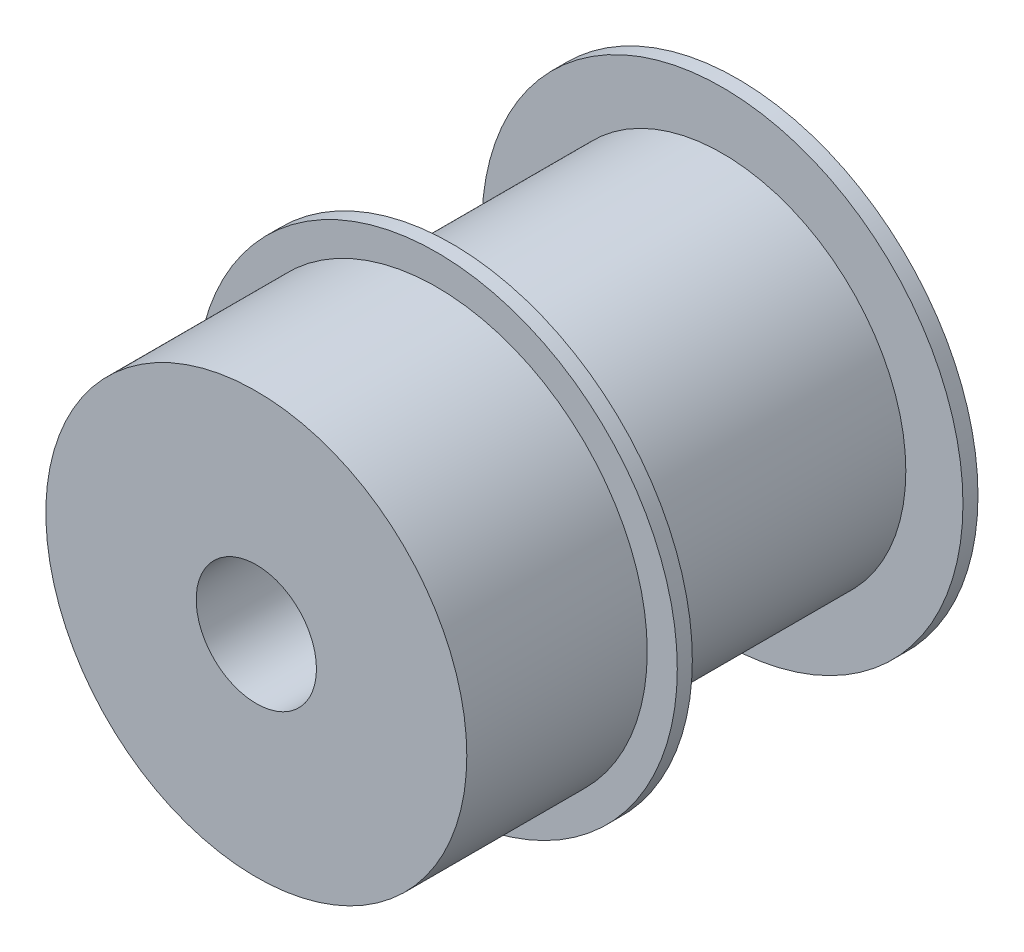
ISO-10303-21;
HEADER;
FILE_DESCRIPTION(('STEP AP214'),'2;1');
FILE_NAME('part.step','',(''),(''),'','','');
FILE_SCHEMA(('AUTOMOTIVE_DESIGN { 1 0 10303 214 1 1 1 1 }'));
ENDSEC;
DATA;
#1=APPLICATION_CONTEXT('core data for automotive mechanical design processes');
#2=APPLICATION_PROTOCOL_DEFINITION('international standard','automotive_design',2000,#1);
#3=PRODUCT_CONTEXT('',#1,'mechanical');
#4=PRODUCT('Part','Part','',(#3));
#5=PRODUCT_RELATED_PRODUCT_CATEGORY('part','',(#4));
#6=PRODUCT_DEFINITION_FORMATION('','',#4);
#7=PRODUCT_DEFINITION_CONTEXT('part definition',#1,'design');
#8=PRODUCT_DEFINITION('design','',#6,#7);
#9=PRODUCT_DEFINITION_SHAPE('','',#8);
#10=(LENGTH_UNIT() NAMED_UNIT(*) SI_UNIT(.MILLI.,.METRE.));
#11=(NAMED_UNIT(*) PLANE_ANGLE_UNIT() SI_UNIT($,.RADIAN.));
#12=(NAMED_UNIT(*) SI_UNIT($,.STERADIAN.) SOLID_ANGLE_UNIT());
#13=UNCERTAINTY_MEASURE_WITH_UNIT(LENGTH_MEASURE(1.E-05),#10,'distance_accuracy_value','');
#14=(GEOMETRIC_REPRESENTATION_CONTEXT(3) GLOBAL_UNCERTAINTY_ASSIGNED_CONTEXT((#13)) GLOBAL_UNIT_ASSIGNED_CONTEXT((#10,
#11,#12)) REPRESENTATION_CONTEXT('',''));
#15=CARTESIAN_POINT('',(0.,0.,0.));
#16=DIRECTION('',(0.,0.,1.));
#17=DIRECTION('',(1.,0.,0.));
#18=AXIS2_PLACEMENT_3D('',#15,#16,#17);
#19=CARTESIAN_POINT('',(0.,0.,10.));
#20=DIRECTION('',(0.,0.,1.));
#21=DIRECTION('',(1.,0.,0.));
#22=AXIS2_PLACEMENT_3D('',#19,#20,#21);
#23=PLANE('',#22);
#24=CARTESIAN_POINT('',(0.,0.,10.));
#25=DIRECTION('',(0.,0.,1.));
#26=DIRECTION('',(1.,0.,0.));
#27=AXIS2_PLACEMENT_3D('',#24,#25,#26);
#28=CIRCLE('',#27,8.);
#29=CARTESIAN_POINT('',(8.,0.,10.));
#30=VERTEX_POINT('',#29);
#31=EDGE_CURVE('E44',#30,#30,#28,.T.);
#32=ORIENTED_EDGE('',*,*,#31,.T.);
#33=EDGE_LOOP('',(#32));
#34=FACE_BOUND('',#33,.T.);
#35=CARTESIAN_POINT('',(0.,0.,10.));
#36=DIRECTION('',(0.,0.,1.));
#37=DIRECTION('',(1.,0.,0.));
#38=AXIS2_PLACEMENT_3D('',#35,#36,#37);
#39=CIRCLE('',#38,7.);
#40=CARTESIAN_POINT('',(7.,0.,10.));
#41=VERTEX_POINT('',#40);
#42=EDGE_CURVE('E53',#41,#41,#39,.T.);
#43=ORIENTED_EDGE('',*,*,#42,.F.);
#44=EDGE_LOOP('',(#43));
#45=FACE_BOUND('',#44,.T.);
#46=ADVANCED_FACE('F28',(#34,#45),#23,.T.);
#47=CARTESIAN_POINT('',(0.,0.,0.5));
#48=DIRECTION('',(0.,0.,1.));
#49=DIRECTION('',(1.,0.,0.));
#50=AXIS2_PLACEMENT_3D('',#47,#48,#49);
#51=PLANE('',#50);
#52=CARTESIAN_POINT('',(0.,0.,0.5));
#53=DIRECTION('',(0.,0.,1.));
#54=DIRECTION('',(1.,0.,0.));
#55=AXIS2_PLACEMENT_3D('',#52,#53,#54);
#56=CIRCLE('',#55,8.);
#57=CARTESIAN_POINT('',(8.,0.,0.5));
#58=VERTEX_POINT('',#57);
#59=EDGE_CURVE('E10',#58,#58,#56,.T.);
#60=ORIENTED_EDGE('',*,*,#59,.T.);
#61=EDGE_LOOP('',(#60));
#62=FACE_BOUND('',#61,.T.);
#63=CARTESIAN_POINT('',(0.,0.,0.5));
#64=DIRECTION('',(0.,0.,1.));
#65=DIRECTION('',(1.,0.,0.));
#66=AXIS2_PLACEMENT_3D('',#63,#64,#65);
#67=CIRCLE('',#66,6.1);
#68=CARTESIAN_POINT('',(6.1,0.,0.5));
#69=VERTEX_POINT('',#68);
#70=EDGE_CURVE('E41',#69,#69,#67,.T.);
#71=ORIENTED_EDGE('',*,*,#70,.F.);
#72=EDGE_LOOP('',(#71));
#73=FACE_BOUND('',#72,.T.);
#74=ADVANCED_FACE('F88',(#62,#73),#51,.T.);
#75=CARTESIAN_POINT('',(0.,0.,0.5));
#76=DIRECTION('',(0.,0.,-1.));
#77=DIRECTION('',(-1.,0.,0.));
#78=AXIS2_PLACEMENT_3D('',#75,#76,#77);
#79=CYLINDRICAL_SURFACE('',#78,8.);
#80=ORIENTED_EDGE('',*,*,#59,.F.);
#81=EDGE_LOOP('',(#80));
#82=FACE_BOUND('',#81,.T.);
#83=CARTESIAN_POINT('',(0.,0.,0.));
#84=DIRECTION('',(0.,0.,1.));
#85=DIRECTION('',(1.,0.,0.));
#86=AXIS2_PLACEMENT_3D('',#83,#84,#85);
#87=CIRCLE('',#86,8.);
#88=CARTESIAN_POINT('',(8.,0.,0.));
#89=VERTEX_POINT('',#88);
#90=EDGE_CURVE('E32',#89,#89,#87,.T.);
#91=ORIENTED_EDGE('',*,*,#90,.T.);
#92=EDGE_LOOP('',(#91));
#93=FACE_BOUND('',#92,.T.);
#94=ADVANCED_FACE('F30',(#82,#93),#79,.T.);
#95=CARTESIAN_POINT('',(0.,0.,0.));
#96=DIRECTION('',(0.,0.,1.));
#97=DIRECTION('',(1.,0.,0.));
#98=AXIS2_PLACEMENT_3D('',#95,#96,#97);
#99=PLANE('',#98);
#100=CARTESIAN_POINT('',(0.,0.,0.));
#101=DIRECTION('',(0.,0.,1.));
#102=DIRECTION('',(1.,0.,0.));
#103=AXIS2_PLACEMENT_3D('',#100,#101,#102);
#104=CIRCLE('',#103,2.);
#105=CARTESIAN_POINT('',(2.,0.,0.));
#106=VERTEX_POINT('',#105);
#107=EDGE_CURVE('E56',#106,#106,#104,.T.);
#108=ORIENTED_EDGE('',*,*,#107,.T.);
#109=EDGE_LOOP('',(#108));
#110=FACE_BOUND('',#109,.T.);
#111=ORIENTED_EDGE('',*,*,#90,.F.);
#112=EDGE_LOOP('',(#111));
#113=FACE_BOUND('',#112,.T.);
#114=ADVANCED_FACE('F65',(#110,#113),#99,.F.);
#115=CARTESIAN_POINT('',(0.,0.,9.5));
#116=DIRECTION('',(0.,0.,-1.));
#117=DIRECTION('',(-1.,0.,0.));
#118=AXIS2_PLACEMENT_3D('',#115,#116,#117);
#119=CYLINDRICAL_SURFACE('',#118,6.1);
#120=CARTESIAN_POINT('',(0.,0.,9.5));
#121=DIRECTION('',(0.,0.,1.));
#122=DIRECTION('',(1.,0.,0.));
#123=AXIS2_PLACEMENT_3D('',#120,#121,#122);
#124=CIRCLE('',#123,6.1);
#125=CARTESIAN_POINT('',(6.1,0.,9.5));
#126=VERTEX_POINT('',#125);
#127=EDGE_CURVE('E39',#126,#126,#124,.T.);
#128=ORIENTED_EDGE('',*,*,#127,.F.);
#129=EDGE_LOOP('',(#128));
#130=FACE_BOUND('',#129,.T.);
#131=ORIENTED_EDGE('',*,*,#70,.T.);
#132=EDGE_LOOP('',(#131));
#133=FACE_BOUND('',#132,.T.);
#134=ADVANCED_FACE('F99',(#130,#133),#119,.T.);
#135=CARTESIAN_POINT('',(0.,0.,9.5));
#136=DIRECTION('',(0.,0.,1.));
#137=DIRECTION('',(1.,0.,0.));
#138=AXIS2_PLACEMENT_3D('',#135,#136,#137);
#139=PLANE('',#138);
#140=CARTESIAN_POINT('',(0.,0.,9.5));
#141=DIRECTION('',(0.,0.,1.));
#142=DIRECTION('',(1.,0.,0.));
#143=AXIS2_PLACEMENT_3D('',#140,#141,#142);
#144=CIRCLE('',#143,8.);
#145=CARTESIAN_POINT('',(8.,0.,9.5));
#146=VERTEX_POINT('',#145);
#147=EDGE_CURVE('E47',#146,#146,#144,.T.);
#148=ORIENTED_EDGE('',*,*,#147,.F.);
#149=EDGE_LOOP('',(#148));
#150=FACE_BOUND('',#149,.T.);
#151=ORIENTED_EDGE('',*,*,#127,.T.);
#152=EDGE_LOOP('',(#151));
#153=FACE_BOUND('',#152,.T.);
#154=ADVANCED_FACE('F96',(#150,#153),#139,.F.);
#155=CARTESIAN_POINT('',(0.,0.,10.));
#156=DIRECTION('',(0.,0.,-1.));
#157=DIRECTION('',(-1.,0.,0.));
#158=AXIS2_PLACEMENT_3D('',#155,#156,#157);
#159=CYLINDRICAL_SURFACE('',#158,8.);
#160=ORIENTED_EDGE('',*,*,#31,.F.);
#161=EDGE_LOOP('',(#160));
#162=FACE_BOUND('',#161,.T.);
#163=ORIENTED_EDGE('',*,*,#147,.T.);
#164=EDGE_LOOP('',(#163));
#165=FACE_BOUND('',#164,.T.);
#166=ADVANCED_FACE('F83',(#162,#165),#159,.T.);
#167=CARTESIAN_POINT('',(0.,0.,16.));
#168=DIRECTION('',(0.,0.,-1.));
#169=DIRECTION('',(-1.,0.,0.));
#170=AXIS2_PLACEMENT_3D('',#167,#168,#169);
#171=CYLINDRICAL_SURFACE('',#170,7.);
#172=CARTESIAN_POINT('',(0.,0.,16.));
#173=DIRECTION('',(0.,0.,1.));
#174=DIRECTION('',(1.,0.,0.));
#175=AXIS2_PLACEMENT_3D('',#172,#173,#174);
#176=CIRCLE('',#175,7.);
#177=CARTESIAN_POINT('',(7.,0.,16.));
#178=VERTEX_POINT('',#177);
#179=EDGE_CURVE('E50',#178,#178,#176,.T.);
#180=ORIENTED_EDGE('',*,*,#179,.F.);
#181=EDGE_LOOP('',(#180));
#182=FACE_BOUND('',#181,.T.);
#183=ORIENTED_EDGE('',*,*,#42,.T.);
#184=EDGE_LOOP('',(#183));
#185=FACE_BOUND('',#184,.T.);
#186=ADVANCED_FACE('F77',(#182,#185),#171,.T.);
#187=CARTESIAN_POINT('',(0.,0.,16.));
#188=DIRECTION('',(0.,0.,1.));
#189=DIRECTION('',(1.,0.,0.));
#190=AXIS2_PLACEMENT_3D('',#187,#188,#189);
#191=PLANE('',#190);
#192=CARTESIAN_POINT('',(0.,0.,16.));
#193=DIRECTION('',(0.,0.,1.));
#194=DIRECTION('',(1.,0.,0.));
#195=AXIS2_PLACEMENT_3D('',#192,#193,#194);
#196=CIRCLE('',#195,2.);
#197=CARTESIAN_POINT('',(2.,0.,16.));
#198=VERTEX_POINT('',#197);
#199=EDGE_CURVE('E59',#198,#198,#196,.T.);
#200=ORIENTED_EDGE('',*,*,#199,.F.);
#201=EDGE_LOOP('',(#200));
#202=FACE_BOUND('',#201,.T.);
#203=ORIENTED_EDGE('',*,*,#179,.T.);
#204=EDGE_LOOP('',(#203));
#205=FACE_BOUND('',#204,.T.);
#206=ADVANCED_FACE('F71',(#202,#205),#191,.T.);
#207=CARTESIAN_POINT('',(0.,0.,0.));
#208=DIRECTION('',(0.,0.,1.));
#209=DIRECTION('',(1.,0.,0.));
#210=AXIS2_PLACEMENT_3D('',#207,#208,#209);
#211=CYLINDRICAL_SURFACE('',#210,2.);
#212=ORIENTED_EDGE('',*,*,#107,.F.);
#213=EDGE_LOOP('',(#212));
#214=FACE_BOUND('',#213,.T.);
#215=ORIENTED_EDGE('',*,*,#199,.T.);
#216=EDGE_LOOP('',(#215));
#217=FACE_BOUND('',#216,.T.);
#218=ADVANCED_FACE('F68',(#214,#217),#211,.F.);
#219=CLOSED_SHELL('',(#46,#74,#94,#114,#134,#154,#166,#186,#206,#218));
#220=MANIFOLD_SOLID_BREP('B2',#219);
#221=ADVANCED_BREP_SHAPE_REPRESENTATION('',(#18,#220),#14);
#222=SHAPE_DEFINITION_REPRESENTATION(#9,#221);
ENDSEC;
END-ISO-10303-21;
